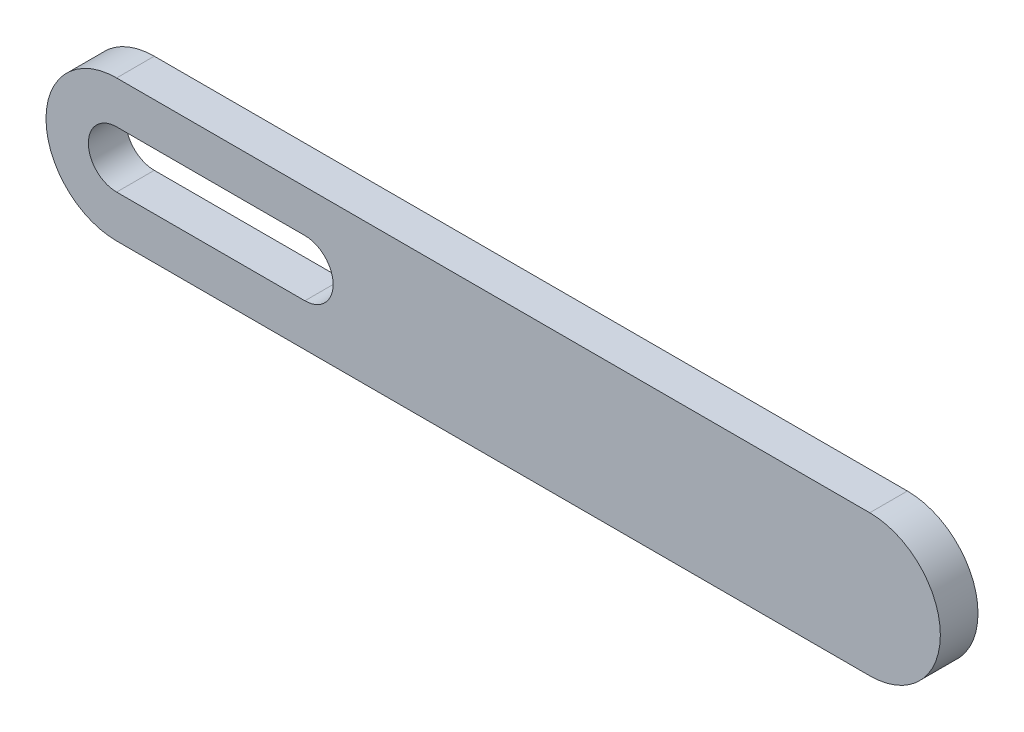
ISO-10303-21;
HEADER;
FILE_DESCRIPTION(('STEP AP214'),'2;1');
FILE_NAME('part.step','',(''),(''),'','','');
FILE_SCHEMA(('AUTOMOTIVE_DESIGN { 1 0 10303 214 1 1 1 1 }'));
ENDSEC;
DATA;
#1=APPLICATION_CONTEXT('core data for automotive mechanical design processes');
#2=APPLICATION_PROTOCOL_DEFINITION('international standard','automotive_design',2000,#1);
#3=PRODUCT_CONTEXT('',#1,'mechanical');
#4=PRODUCT('Part','Part','',(#3));
#5=PRODUCT_RELATED_PRODUCT_CATEGORY('part','',(#4));
#6=PRODUCT_DEFINITION_FORMATION('','',#4);
#7=PRODUCT_DEFINITION_CONTEXT('part definition',#1,'design');
#8=PRODUCT_DEFINITION('design','',#6,#7);
#9=PRODUCT_DEFINITION_SHAPE('','',#8);
#10=(LENGTH_UNIT() NAMED_UNIT(*) SI_UNIT(.MILLI.,.METRE.));
#11=(NAMED_UNIT(*) PLANE_ANGLE_UNIT() SI_UNIT($,.RADIAN.));
#12=(NAMED_UNIT(*) SI_UNIT($,.STERADIAN.) SOLID_ANGLE_UNIT());
#13=UNCERTAINTY_MEASURE_WITH_UNIT(LENGTH_MEASURE(1.E-05),#10,'distance_accuracy_value','');
#14=(GEOMETRIC_REPRESENTATION_CONTEXT(3) GLOBAL_UNCERTAINTY_ASSIGNED_CONTEXT((#13)) GLOBAL_UNIT_ASSIGNED_CONTEXT((#10,
#11,#12)) REPRESENTATION_CONTEXT('',''));
#15=CARTESIAN_POINT('',(0.,0.,0.));
#16=DIRECTION('',(0.,0.,1.));
#17=DIRECTION('',(1.,0.,0.));
#18=AXIS2_PLACEMENT_3D('',#15,#16,#17);
#19=CARTESIAN_POINT('',(-50.,0.,20.));
#20=DIRECTION('',(0.,0.,1.));
#21=DIRECTION('',(1.,0.,0.));
#22=AXIS2_PLACEMENT_3D('',#19,#20,#21);
#23=PLANE('',#22);
#24=CARTESIAN_POINT('',(-50.,0.,20.));
#25=DIRECTION('',(0.,0.,1.));
#26=DIRECTION('',(1.,0.,0.));
#27=AXIS2_PLACEMENT_3D('',#24,#25,#26);
#28=CIRCLE('',#27,37.5);
#29=CARTESIAN_POINT('',(-50.,37.5,20.));
#30=VERTEX_POINT('',#29);
#31=CARTESIAN_POINT('',(-50.,-37.5,20.));
#32=VERTEX_POINT('',#31);
#33=EDGE_CURVE('E133',#30,#32,#28,.T.);
#34=ORIENTED_EDGE('',*,*,#33,.T.);
#35=DIRECTION('',(1.,0.,0.));
#36=VECTOR('',#35,1.);
#37=CARTESIAN_POINT('',(-50.,-37.5,20.));
#38=LINE('',#37,#36);
#39=CARTESIAN_POINT('',(350.,-37.5000000000001,20.));
#40=VERTEX_POINT('',#39);
#41=EDGE_CURVE('E136',#32,#40,#38,.T.);
#42=ORIENTED_EDGE('',*,*,#41,.T.);
#43=CARTESIAN_POINT('',(350.,0.,20.));
#44=DIRECTION('',(0.,0.,1.));
#45=DIRECTION('',(-1.,0.,0.));
#46=AXIS2_PLACEMENT_3D('',#43,#44,#45);
#47=CIRCLE('',#46,37.5);
#48=CARTESIAN_POINT('',(350.,37.5,20.));
#49=VERTEX_POINT('',#48);
#50=EDGE_CURVE('E139',#40,#49,#47,.T.);
#51=ORIENTED_EDGE('',*,*,#50,.T.);
#52=DIRECTION('',(-1.,0.,0.));
#53=VECTOR('',#52,1.);
#54=CARTESIAN_POINT('',(-50.,37.5,20.));
#55=LINE('',#54,#53);
#56=EDGE_CURVE('E141',#49,#30,#55,.T.);
#57=ORIENTED_EDGE('',*,*,#56,.T.);
#58=EDGE_LOOP('',(#34,#42,#51,#57));
#59=FACE_BOUND('',#58,.T.);
#60=DIRECTION('',(1.,0.,0.));
#61=VECTOR('',#60,1.);
#62=CARTESIAN_POINT('',(-50.,-15.,20.));
#63=LINE('',#62,#61);
#64=CARTESIAN_POINT('',(-50.,-15.,20.));
#65=VERTEX_POINT('',#64);
#66=CARTESIAN_POINT('',(50.,-15.,20.));
#67=VERTEX_POINT('',#66);
#68=EDGE_CURVE('E105',#65,#67,#63,.T.);
#69=ORIENTED_EDGE('',*,*,#68,.F.);
#70=CARTESIAN_POINT('',(-50.,0.,20.));
#71=DIRECTION('',(0.,0.,1.));
#72=DIRECTION('',(1.,0.,0.));
#73=AXIS2_PLACEMENT_3D('',#70,#71,#72);
#74=CIRCLE('',#73,15.);
#75=CARTESIAN_POINT('',(-50.,15.,20.));
#76=VERTEX_POINT('',#75);
#77=EDGE_CURVE('E97',#76,#65,#74,.T.);
#78=ORIENTED_EDGE('',*,*,#77,.F.);
#79=DIRECTION('',(-1.,0.,0.));
#80=VECTOR('',#79,1.);
#81=CARTESIAN_POINT('',(-50.,15.,20.));
#82=LINE('',#81,#80);
#83=CARTESIAN_POINT('',(50.,15.,20.));
#84=VERTEX_POINT('',#83);
#85=EDGE_CURVE('E119',#84,#76,#82,.T.);
#86=ORIENTED_EDGE('',*,*,#85,.F.);
#87=CARTESIAN_POINT('',(50.,0.,20.));
#88=DIRECTION('',(0.,0.,1.));
#89=DIRECTION('',(-1.,0.,0.));
#90=AXIS2_PLACEMENT_3D('',#87,#88,#89);
#91=CIRCLE('',#90,15.);
#92=EDGE_CURVE('E117',#67,#84,#91,.T.);
#93=ORIENTED_EDGE('',*,*,#92,.F.);
#94=EDGE_LOOP('',(#69,#78,#86,#93));
#95=FACE_BOUND('',#94,.T.);
#96=ADVANCED_FACE('F32',(#59,#95),#23,.T.);
#97=CARTESIAN_POINT('',(-50.,0.,0.));
#98=DIRECTION('',(0.,0.,1.));
#99=DIRECTION('',(1.,0.,0.));
#100=AXIS2_PLACEMENT_3D('',#97,#98,#99);
#101=PLANE('',#100);
#102=CARTESIAN_POINT('',(-50.,0.,0.));
#103=DIRECTION('',(0.,0.,1.));
#104=DIRECTION('',(1.,0.,0.));
#105=AXIS2_PLACEMENT_3D('',#102,#103,#104);
#106=CIRCLE('',#105,37.5);
#107=CARTESIAN_POINT('',(-50.,37.5,0.));
#108=VERTEX_POINT('',#107);
#109=CARTESIAN_POINT('',(-50.,-37.5,0.));
#110=VERTEX_POINT('',#109);
#111=EDGE_CURVE('E113',#108,#110,#106,.T.);
#112=ORIENTED_EDGE('',*,*,#111,.F.);
#113=DIRECTION('',(-1.,0.,0.));
#114=VECTOR('',#113,1.);
#115=CARTESIAN_POINT('',(-50.,37.5,0.));
#116=LINE('',#115,#114);
#117=CARTESIAN_POINT('',(350.,37.5,0.));
#118=VERTEX_POINT('',#117);
#119=EDGE_CURVE('E137',#118,#108,#116,.T.);
#120=ORIENTED_EDGE('',*,*,#119,.F.);
#121=CARTESIAN_POINT('',(350.,0.,0.));
#122=DIRECTION('',(0.,0.,1.));
#123=DIRECTION('',(-1.,0.,0.));
#124=AXIS2_PLACEMENT_3D('',#121,#122,#123);
#125=CIRCLE('',#124,37.5);
#126=CARTESIAN_POINT('',(350.,-37.5000000000001,0.));
#127=VERTEX_POINT('',#126);
#128=EDGE_CURVE('E148',#127,#118,#125,.T.);
#129=ORIENTED_EDGE('',*,*,#128,.F.);
#130=DIRECTION('',(1.,0.,0.));
#131=VECTOR('',#130,1.);
#132=CARTESIAN_POINT('',(-50.,-37.5,0.));
#133=LINE('',#132,#131);
#134=EDGE_CURVE('E146',#110,#127,#133,.T.);
#135=ORIENTED_EDGE('',*,*,#134,.F.);
#136=EDGE_LOOP('',(#112,#120,#129,#135));
#137=FACE_BOUND('',#136,.T.);
#138=CARTESIAN_POINT('',(-50.,0.,0.));
#139=DIRECTION('',(0.,0.,1.));
#140=DIRECTION('',(1.,0.,0.));
#141=AXIS2_PLACEMENT_3D('',#138,#139,#140);
#142=CIRCLE('',#141,15.);
#143=CARTESIAN_POINT('',(-50.,15.,0.));
#144=VERTEX_POINT('',#143);
#145=CARTESIAN_POINT('',(-50.,-15.,0.));
#146=VERTEX_POINT('',#145);
#147=EDGE_CURVE('E55',#144,#146,#142,.T.);
#148=ORIENTED_EDGE('',*,*,#147,.T.);
#149=DIRECTION('',(1.,0.,0.));
#150=VECTOR('',#149,1.);
#151=CARTESIAN_POINT('',(-50.,-15.,0.));
#152=LINE('',#151,#150);
#153=CARTESIAN_POINT('',(50.,-15.,0.));
#154=VERTEX_POINT('',#153);
#155=EDGE_CURVE('E112',#146,#154,#152,.T.);
#156=ORIENTED_EDGE('',*,*,#155,.T.);
#157=CARTESIAN_POINT('',(50.,0.,0.));
#158=DIRECTION('',(0.,0.,1.));
#159=DIRECTION('',(-1.,0.,0.));
#160=AXIS2_PLACEMENT_3D('',#157,#158,#159);
#161=CIRCLE('',#160,15.);
#162=CARTESIAN_POINT('',(50.,15.,0.));
#163=VERTEX_POINT('',#162);
#164=EDGE_CURVE('E125',#154,#163,#161,.T.);
#165=ORIENTED_EDGE('',*,*,#164,.T.);
#166=DIRECTION('',(-1.,0.,0.));
#167=VECTOR('',#166,1.);
#168=CARTESIAN_POINT('',(-50.,15.,0.));
#169=LINE('',#168,#167);
#170=EDGE_CURVE('E106',#163,#144,#169,.T.);
#171=ORIENTED_EDGE('',*,*,#170,.T.);
#172=EDGE_LOOP('',(#148,#156,#165,#171));
#173=FACE_BOUND('',#172,.T.);
#174=ADVANCED_FACE('F166',(#137,#173),#101,.F.);
#175=CARTESIAN_POINT('',(-50.,0.,20.));
#176=DIRECTION('',(0.,0.,-1.));
#177=DIRECTION('',(-1.,0.,0.));
#178=AXIS2_PLACEMENT_3D('',#175,#176,#177);
#179=CYLINDRICAL_SURFACE('',#178,37.5);
#180=ORIENTED_EDGE('',*,*,#111,.T.);
#181=DIRECTION('',(0.,0.,-1.));
#182=VECTOR('',#181,1.);
#183=CARTESIAN_POINT('',(-50.,-37.5,20.));
#184=LINE('',#183,#182);
#185=EDGE_CURVE('E11',#32,#110,#184,.T.);
#186=ORIENTED_EDGE('',*,*,#185,.F.);
#187=ORIENTED_EDGE('',*,*,#33,.F.);
#188=DIRECTION('',(0.,0.,-1.));
#189=VECTOR('',#188,1.);
#190=CARTESIAN_POINT('',(-50.,37.5,20.));
#191=LINE('',#190,#189);
#192=EDGE_CURVE('E143',#30,#108,#191,.T.);
#193=ORIENTED_EDGE('',*,*,#192,.T.);
#194=EDGE_LOOP('',(#180,#186,#187,#193));
#195=FACE_BOUND('',#194,.T.);
#196=ADVANCED_FACE('F34',(#195),#179,.T.);
#197=CARTESIAN_POINT('',(-50.,-37.5,20.));
#198=DIRECTION('',(0.,1.,0.));
#199=DIRECTION('',(0.,0.,1.));
#200=AXIS2_PLACEMENT_3D('',#197,#198,#199);
#201=PLANE('',#200);
#202=ORIENTED_EDGE('',*,*,#134,.T.);
#203=DIRECTION('',(0.,0.,-1.));
#204=VECTOR('',#203,1.);
#205=CARTESIAN_POINT('',(350.,-37.5000000000001,20.));
#206=LINE('',#205,#204);
#207=EDGE_CURVE('E40',#40,#127,#206,.T.);
#208=ORIENTED_EDGE('',*,*,#207,.F.);
#209=ORIENTED_EDGE('',*,*,#41,.F.);
#210=ORIENTED_EDGE('',*,*,#185,.T.);
#211=EDGE_LOOP('',(#202,#208,#209,#210));
#212=FACE_BOUND('',#211,.T.);
#213=ADVANCED_FACE('F176',(#212),#201,.F.);
#214=CARTESIAN_POINT('',(350.,0.,20.));
#215=DIRECTION('',(0.,0.,-1.));
#216=DIRECTION('',(-1.,0.,0.));
#217=AXIS2_PLACEMENT_3D('',#214,#215,#216);
#218=CYLINDRICAL_SURFACE('',#217,37.5);
#219=ORIENTED_EDGE('',*,*,#128,.T.);
#220=DIRECTION('',(0.,0.,-1.));
#221=VECTOR('',#220,1.);
#222=CARTESIAN_POINT('',(350.,37.5,20.));
#223=LINE('',#222,#221);
#224=EDGE_CURVE('E153',#49,#118,#223,.T.);
#225=ORIENTED_EDGE('',*,*,#224,.F.);
#226=ORIENTED_EDGE('',*,*,#50,.F.);
#227=ORIENTED_EDGE('',*,*,#207,.T.);
#228=EDGE_LOOP('',(#219,#225,#226,#227));
#229=FACE_BOUND('',#228,.T.);
#230=ADVANCED_FACE('F160',(#229),#218,.T.);
#231=CARTESIAN_POINT('',(-50.,37.5,20.));
#232=DIRECTION('',(0.,-1.,0.));
#233=DIRECTION('',(0.,0.,-1.));
#234=AXIS2_PLACEMENT_3D('',#231,#232,#233);
#235=PLANE('',#234);
#236=ORIENTED_EDGE('',*,*,#119,.T.);
#237=ORIENTED_EDGE('',*,*,#192,.F.);
#238=ORIENTED_EDGE('',*,*,#56,.F.);
#239=ORIENTED_EDGE('',*,*,#224,.T.);
#240=EDGE_LOOP('',(#236,#237,#238,#239));
#241=FACE_BOUND('',#240,.T.);
#242=ADVANCED_FACE('F170',(#241),#235,.F.);
#243=CARTESIAN_POINT('',(-50.,0.,20.));
#244=DIRECTION('',(0.,0.,-1.));
#245=DIRECTION('',(-1.,0.,0.));
#246=AXIS2_PLACEMENT_3D('',#243,#244,#245);
#247=CYLINDRICAL_SURFACE('',#246,15.);
#248=ORIENTED_EDGE('',*,*,#147,.F.);
#249=DIRECTION('',(0.,0.,-1.));
#250=VECTOR('',#249,1.);
#251=CARTESIAN_POINT('',(-50.,15.,20.));
#252=LINE('',#251,#250);
#253=EDGE_CURVE('E101',#76,#144,#252,.T.);
#254=ORIENTED_EDGE('',*,*,#253,.F.);
#255=ORIENTED_EDGE('',*,*,#77,.T.);
#256=DIRECTION('',(0.,0.,-1.));
#257=VECTOR('',#256,1.);
#258=CARTESIAN_POINT('',(-50.,-15.,20.));
#259=LINE('',#258,#257);
#260=EDGE_CURVE('E100',#65,#146,#259,.T.);
#261=ORIENTED_EDGE('',*,*,#260,.T.);
#262=EDGE_LOOP('',(#248,#254,#255,#261));
#263=FACE_BOUND('',#262,.T.);
#264=ADVANCED_FACE('F99',(#263),#247,.F.);
#265=CARTESIAN_POINT('',(-50.,-15.,20.));
#266=DIRECTION('',(0.,1.,0.));
#267=DIRECTION('',(0.,0.,1.));
#268=AXIS2_PLACEMENT_3D('',#265,#266,#267);
#269=PLANE('',#268);
#270=ORIENTED_EDGE('',*,*,#155,.F.);
#271=ORIENTED_EDGE('',*,*,#260,.F.);
#272=ORIENTED_EDGE('',*,*,#68,.T.);
#273=DIRECTION('',(0.,0.,-1.));
#274=VECTOR('',#273,1.);
#275=CARTESIAN_POINT('',(50.,-15.,20.));
#276=LINE('',#275,#274);
#277=EDGE_CURVE('E114',#67,#154,#276,.T.);
#278=ORIENTED_EDGE('',*,*,#277,.T.);
#279=EDGE_LOOP('',(#270,#271,#272,#278));
#280=FACE_BOUND('',#279,.T.);
#281=ADVANCED_FACE('F109',(#280),#269,.T.);
#282=CARTESIAN_POINT('',(50.,0.,20.));
#283=DIRECTION('',(0.,0.,-1.));
#284=DIRECTION('',(-1.,0.,0.));
#285=AXIS2_PLACEMENT_3D('',#282,#283,#284);
#286=CYLINDRICAL_SURFACE('',#285,15.);
#287=ORIENTED_EDGE('',*,*,#164,.F.);
#288=ORIENTED_EDGE('',*,*,#277,.F.);
#289=ORIENTED_EDGE('',*,*,#92,.T.);
#290=DIRECTION('',(0.,0.,-1.));
#291=VECTOR('',#290,1.);
#292=CARTESIAN_POINT('',(50.,15.,20.));
#293=LINE('',#292,#291);
#294=EDGE_CURVE('E47',#84,#163,#293,.T.);
#295=ORIENTED_EDGE('',*,*,#294,.T.);
#296=EDGE_LOOP('',(#287,#288,#289,#295));
#297=FACE_BOUND('',#296,.T.);
#298=ADVANCED_FACE('F199',(#297),#286,.F.);
#299=CARTESIAN_POINT('',(-50.,15.,20.));
#300=DIRECTION('',(0.,-1.,0.));
#301=DIRECTION('',(1.,0.,0.));
#302=AXIS2_PLACEMENT_3D('',#299,#300,#301);
#303=PLANE('',#302);
#304=ORIENTED_EDGE('',*,*,#170,.F.);
#305=ORIENTED_EDGE('',*,*,#294,.F.);
#306=ORIENTED_EDGE('',*,*,#85,.T.);
#307=ORIENTED_EDGE('',*,*,#253,.T.);
#308=EDGE_LOOP('',(#304,#305,#306,#307));
#309=FACE_BOUND('',#308,.T.);
#310=ADVANCED_FACE('F203',(#309),#303,.T.);
#311=CLOSED_SHELL('',(#96,#174,#196,#213,#230,#242,#264,#281,#298,#310));
#312=MANIFOLD_SOLID_BREP('B2',#311);
#313=ADVANCED_BREP_SHAPE_REPRESENTATION('',(#18,#312),#14);
#314=SHAPE_DEFINITION_REPRESENTATION(#9,#313);
ENDSEC;
END-ISO-10303-21;
